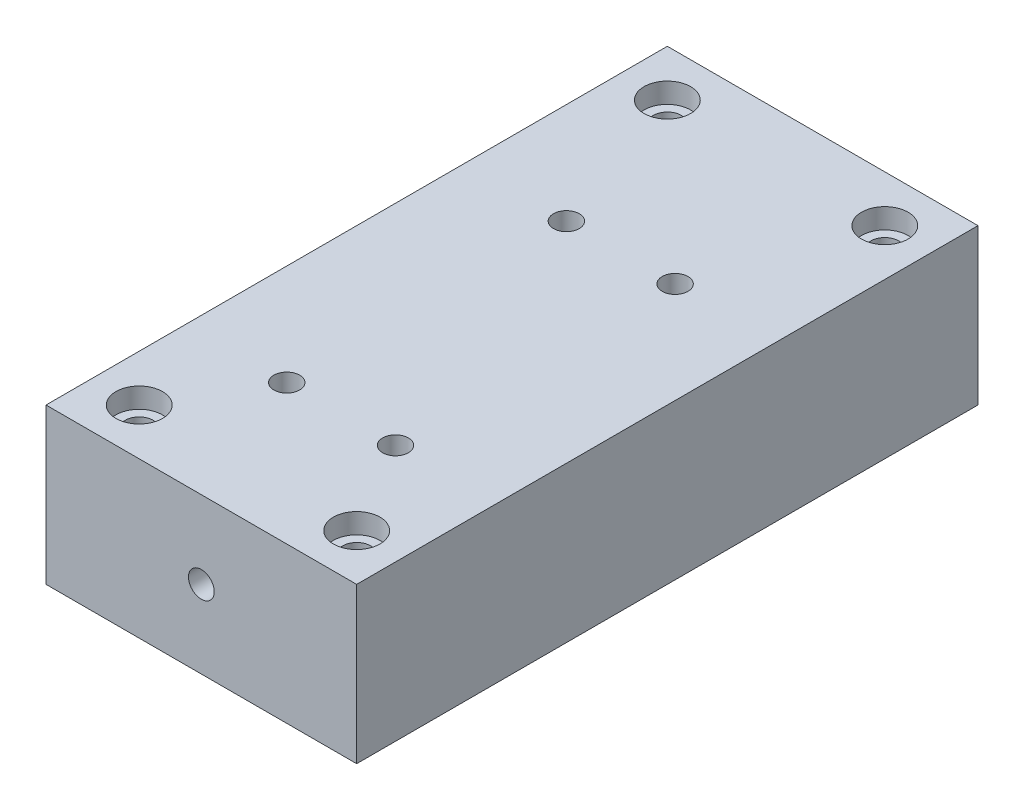
ISO-10303-21;
HEADER;
FILE_DESCRIPTION(('STEP AP214'),'2;1');
FILE_NAME('part.step','',(''),(''),'','','');
FILE_SCHEMA(('AUTOMOTIVE_DESIGN { 1 0 10303 214 1 1 1 1 }'));
ENDSEC;
DATA;
#1=APPLICATION_CONTEXT('core data for automotive mechanical design processes');
#2=APPLICATION_PROTOCOL_DEFINITION('international standard','automotive_design',2000,#1);
#3=PRODUCT_CONTEXT('',#1,'mechanical');
#4=PRODUCT('Part','Part','',(#3));
#5=PRODUCT_RELATED_PRODUCT_CATEGORY('part','',(#4));
#6=PRODUCT_DEFINITION_FORMATION('','',#4);
#7=PRODUCT_DEFINITION_CONTEXT('part definition',#1,'design');
#8=PRODUCT_DEFINITION('design','',#6,#7);
#9=PRODUCT_DEFINITION_SHAPE('','',#8);
#10=(LENGTH_UNIT() NAMED_UNIT(*) SI_UNIT(.MILLI.,.METRE.));
#11=(NAMED_UNIT(*) PLANE_ANGLE_UNIT() SI_UNIT($,.RADIAN.));
#12=(NAMED_UNIT(*) SI_UNIT($,.STERADIAN.) SOLID_ANGLE_UNIT());
#13=UNCERTAINTY_MEASURE_WITH_UNIT(LENGTH_MEASURE(1.E-05),#10,'distance_accuracy_value','');
#14=(GEOMETRIC_REPRESENTATION_CONTEXT(3) GLOBAL_UNCERTAINTY_ASSIGNED_CONTEXT((#13)) GLOBAL_UNIT_ASSIGNED_CONTEXT((#10,
#11,#12)) REPRESENTATION_CONTEXT('',''));
#15=CARTESIAN_POINT('',(0.,0.,0.));
#16=DIRECTION('',(0.,0.,1.));
#17=DIRECTION('',(1.,0.,0.));
#18=AXIS2_PLACEMENT_3D('',#15,#16,#17);
#19=CARTESIAN_POINT('',(50.,-25.,200.));
#20=DIRECTION('',(0.,-1.,0.));
#21=DIRECTION('',(1.,0.,0.));
#22=AXIS2_PLACEMENT_3D('',#19,#20,#21);
#23=PLANE('',#22);
#24=CARTESIAN_POINT('',(-35.,-25.,15.));
#25=DIRECTION('',(0.,1.,0.));
#26=DIRECTION('',(0.,0.,1.));
#27=AXIS2_PLACEMENT_3D('',#24,#25,#26);
#28=CIRCLE('',#27,4.49999999999999);
#29=CARTESIAN_POINT('',(-35.,-25.,19.5));
#30=VERTEX_POINT('',#29);
#31=EDGE_CURVE('E157',#30,#30,#28,.T.);
#32=ORIENTED_EDGE('',*,*,#31,.T.);
#33=EDGE_LOOP('',(#32));
#34=FACE_BOUND('',#33,.T.);
#35=CARTESIAN_POINT('',(35.,-25.,15.));
#36=DIRECTION('',(0.,1.,0.));
#37=DIRECTION('',(0.,0.,1.));
#38=AXIS2_PLACEMENT_3D('',#35,#36,#37);
#39=CIRCLE('',#38,4.49999999999999);
#40=CARTESIAN_POINT('',(35.,-25.,19.5));
#41=VERTEX_POINT('',#40);
#42=EDGE_CURVE('E169',#41,#41,#39,.T.);
#43=ORIENTED_EDGE('',*,*,#42,.T.);
#44=EDGE_LOOP('',(#43));
#45=FACE_BOUND('',#44,.T.);
#46=CARTESIAN_POINT('',(35.,-25.,185.));
#47=DIRECTION('',(0.,1.,0.));
#48=DIRECTION('',(0.,0.,1.));
#49=AXIS2_PLACEMENT_3D('',#46,#47,#48);
#50=CIRCLE('',#49,4.49999999999999);
#51=CARTESIAN_POINT('',(35.,-25.,189.5));
#52=VERTEX_POINT('',#51);
#53=EDGE_CURVE('E181',#52,#52,#50,.T.);
#54=ORIENTED_EDGE('',*,*,#53,.T.);
#55=EDGE_LOOP('',(#54));
#56=FACE_BOUND('',#55,.T.);
#57=CARTESIAN_POINT('',(-35.,-25.,185.));
#58=DIRECTION('',(0.,1.,0.));
#59=DIRECTION('',(0.,0.,1.));
#60=AXIS2_PLACEMENT_3D('',#57,#58,#59);
#61=CIRCLE('',#60,4.49999999999999);
#62=CARTESIAN_POINT('',(-35.,-25.,189.5));
#63=VERTEX_POINT('',#62);
#64=EDGE_CURVE('E193',#63,#63,#61,.T.);
#65=ORIENTED_EDGE('',*,*,#64,.T.);
#66=EDGE_LOOP('',(#65));
#67=FACE_BOUND('',#66,.T.);
#68=DIRECTION('',(-1.,0.,0.));
#69=VECTOR('',#68,1.);
#70=CARTESIAN_POINT('',(50.,-25.,0.));
#71=LINE('',#70,#69);
#72=CARTESIAN_POINT('',(50.,-25.,0.));
#73=VERTEX_POINT('',#72);
#74=CARTESIAN_POINT('',(-50.,-25.,0.));
#75=VERTEX_POINT('',#74);
#76=EDGE_CURVE('E196',#73,#75,#71,.T.);
#77=ORIENTED_EDGE('',*,*,#76,.F.);
#78=DIRECTION('',(0.,0.,-1.));
#79=VECTOR('',#78,1.);
#80=CARTESIAN_POINT('',(50.,-25.,200.));
#81=LINE('',#80,#79);
#82=CARTESIAN_POINT('',(50.,-25.,200.));
#83=VERTEX_POINT('',#82);
#84=EDGE_CURVE('E11',#83,#73,#81,.T.);
#85=ORIENTED_EDGE('',*,*,#84,.F.);
#86=DIRECTION('',(-1.,0.,0.));
#87=VECTOR('',#86,1.);
#88=CARTESIAN_POINT('',(50.,-25.,200.));
#89=LINE('',#88,#87);
#90=CARTESIAN_POINT('',(-50.,-25.,200.));
#91=VERTEX_POINT('',#90);
#92=EDGE_CURVE('E197',#83,#91,#89,.T.);
#93=ORIENTED_EDGE('',*,*,#92,.T.);
#94=DIRECTION('',(0.,0.,-1.));
#95=VECTOR('',#94,1.);
#96=CARTESIAN_POINT('',(-50.,-25.,200.));
#97=LINE('',#96,#95);
#98=EDGE_CURVE('E35',#91,#75,#97,.T.);
#99=ORIENTED_EDGE('',*,*,#98,.T.);
#100=EDGE_LOOP('',(#77,#85,#93,#99));
#101=FACE_BOUND('',#100,.T.);
#102=ADVANCED_FACE('F32',(#34,#45,#56,#67,#101),#23,.T.);
#103=CARTESIAN_POINT('',(50.,-25.,200.));
#104=DIRECTION('',(-1.,0.,0.));
#105=DIRECTION('',(0.,0.,1.));
#106=AXIS2_PLACEMENT_3D('',#103,#104,#105);
#107=PLANE('',#106);
#108=DIRECTION('',(0.,1.,0.));
#109=VECTOR('',#108,1.);
#110=CARTESIAN_POINT('',(50.,-25.,0.));
#111=LINE('',#110,#109);
#112=CARTESIAN_POINT('',(50.,25.,0.));
#113=VERTEX_POINT('',#112);
#114=EDGE_CURVE('E66',#73,#113,#111,.T.);
#115=ORIENTED_EDGE('',*,*,#114,.T.);
#116=DIRECTION('',(0.,0.,-1.));
#117=VECTOR('',#116,1.);
#118=CARTESIAN_POINT('',(50.,25.,200.));
#119=LINE('',#118,#117);
#120=CARTESIAN_POINT('',(50.,25.,200.));
#121=VERTEX_POINT('',#120);
#122=EDGE_CURVE('E41',#121,#113,#119,.T.);
#123=ORIENTED_EDGE('',*,*,#122,.F.);
#124=DIRECTION('',(0.,1.,0.));
#125=VECTOR('',#124,1.);
#126=CARTESIAN_POINT('',(50.,-25.,200.));
#127=LINE('',#126,#125);
#128=EDGE_CURVE('E203',#83,#121,#127,.T.);
#129=ORIENTED_EDGE('',*,*,#128,.F.);
#130=ORIENTED_EDGE('',*,*,#84,.T.);
#131=EDGE_LOOP('',(#115,#123,#129,#130));
#132=FACE_BOUND('',#131,.T.);
#133=ADVANCED_FACE('F224',(#132),#107,.F.);
#134=CARTESIAN_POINT('',(50.,25.,200.));
#135=DIRECTION('',(0.,-1.,0.));
#136=DIRECTION('',(1.,0.,0.));
#137=AXIS2_PLACEMENT_3D('',#134,#135,#136);
#138=PLANE('',#137);
#139=CARTESIAN_POINT('',(-17.5,25.,65.));
#140=DIRECTION('',(0.,1.,0.));
#141=DIRECTION('',(0.,0.,1.));
#142=AXIS2_PLACEMENT_3D('',#139,#140,#141);
#143=CIRCLE('',#142,4.14999999999999);
#144=CARTESIAN_POINT('',(-17.5,25.,69.15));
#145=VERTEX_POINT('',#144);
#146=EDGE_CURVE('E108',#145,#145,#143,.T.);
#147=ORIENTED_EDGE('',*,*,#146,.F.);
#148=EDGE_LOOP('',(#147));
#149=FACE_BOUND('',#148,.T.);
#150=CARTESIAN_POINT('',(17.5,25.,65.));
#151=DIRECTION('',(0.,1.,0.));
#152=DIRECTION('',(0.,0.,1.));
#153=AXIS2_PLACEMENT_3D('',#150,#151,#152);
#154=CIRCLE('',#153,4.14999999999999);
#155=CARTESIAN_POINT('',(17.5,25.,69.15));
#156=VERTEX_POINT('',#155);
#157=EDGE_CURVE('E107',#156,#156,#154,.T.);
#158=ORIENTED_EDGE('',*,*,#157,.F.);
#159=EDGE_LOOP('',(#158));
#160=FACE_BOUND('',#159,.T.);
#161=CARTESIAN_POINT('',(17.5,25.,155.));
#162=DIRECTION('',(0.,1.,0.));
#163=DIRECTION('',(0.,0.,1.));
#164=AXIS2_PLACEMENT_3D('',#161,#162,#163);
#165=CIRCLE('',#164,4.14999999999999);
#166=CARTESIAN_POINT('',(17.5,25.,159.15));
#167=VERTEX_POINT('',#166);
#168=EDGE_CURVE('E118',#167,#167,#165,.T.);
#169=ORIENTED_EDGE('',*,*,#168,.F.);
#170=EDGE_LOOP('',(#169));
#171=FACE_BOUND('',#170,.T.);
#172=CARTESIAN_POINT('',(-17.5,25.,155.));
#173=DIRECTION('',(0.,1.,0.));
#174=DIRECTION('',(0.,0.,1.));
#175=AXIS2_PLACEMENT_3D('',#172,#173,#174);
#176=CIRCLE('',#175,4.14999999999999);
#177=CARTESIAN_POINT('',(-17.5,25.,159.15));
#178=VERTEX_POINT('',#177);
#179=EDGE_CURVE('E124',#178,#178,#176,.T.);
#180=ORIENTED_EDGE('',*,*,#179,.F.);
#181=EDGE_LOOP('',(#180));
#182=FACE_BOUND('',#181,.T.);
#183=CARTESIAN_POINT('',(-35.,25.,15.));
#184=DIRECTION('',(0.,1.,0.));
#185=DIRECTION('',(0.,0.,1.));
#186=AXIS2_PLACEMENT_3D('',#183,#184,#185);
#187=CIRCLE('',#186,7.5);
#188=CARTESIAN_POINT('',(-35.,25.,22.5));
#189=VERTEX_POINT('',#188);
#190=EDGE_CURVE('E148',#189,#189,#187,.T.);
#191=ORIENTED_EDGE('',*,*,#190,.F.);
#192=EDGE_LOOP('',(#191));
#193=FACE_BOUND('',#192,.T.);
#194=CARTESIAN_POINT('',(35.,25.,15.));
#195=DIRECTION('',(0.,1.,0.));
#196=DIRECTION('',(0.,0.,1.));
#197=AXIS2_PLACEMENT_3D('',#194,#195,#196);
#198=CIRCLE('',#197,7.5);
#199=CARTESIAN_POINT('',(35.,25.,22.5));
#200=VERTEX_POINT('',#199);
#201=EDGE_CURVE('E160',#200,#200,#198,.T.);
#202=ORIENTED_EDGE('',*,*,#201,.F.);
#203=EDGE_LOOP('',(#202));
#204=FACE_BOUND('',#203,.T.);
#205=CARTESIAN_POINT('',(35.,25.,185.));
#206=DIRECTION('',(0.,1.,0.));
#207=DIRECTION('',(0.,0.,1.));
#208=AXIS2_PLACEMENT_3D('',#205,#206,#207);
#209=CIRCLE('',#208,7.5);
#210=CARTESIAN_POINT('',(35.,25.,192.5));
#211=VERTEX_POINT('',#210);
#212=EDGE_CURVE('E172',#211,#211,#209,.T.);
#213=ORIENTED_EDGE('',*,*,#212,.F.);
#214=EDGE_LOOP('',(#213));
#215=FACE_BOUND('',#214,.T.);
#216=CARTESIAN_POINT('',(-35.,25.,185.));
#217=DIRECTION('',(0.,1.,0.));
#218=DIRECTION('',(0.,0.,1.));
#219=AXIS2_PLACEMENT_3D('',#216,#217,#218);
#220=CIRCLE('',#219,7.5);
#221=CARTESIAN_POINT('',(-35.,25.,192.5));
#222=VERTEX_POINT('',#221);
#223=EDGE_CURVE('E184',#222,#222,#220,.T.);
#224=ORIENTED_EDGE('',*,*,#223,.F.);
#225=EDGE_LOOP('',(#224));
#226=FACE_BOUND('',#225,.T.);
#227=DIRECTION('',(-1.,0.,0.));
#228=VECTOR('',#227,1.);
#229=CARTESIAN_POINT('',(50.,25.,0.));
#230=LINE('',#229,#228);
#231=CARTESIAN_POINT('',(-50.,25.,0.));
#232=VERTEX_POINT('',#231);
#233=EDGE_CURVE('E210',#113,#232,#230,.T.);
#234=ORIENTED_EDGE('',*,*,#233,.T.);
#235=DIRECTION('',(0.,0.,-1.));
#236=VECTOR('',#235,1.);
#237=CARTESIAN_POINT('',(-50.,25.,200.));
#238=LINE('',#237,#236);
#239=CARTESIAN_POINT('',(-50.,25.,200.));
#240=VERTEX_POINT('',#239);
#241=EDGE_CURVE('E214',#240,#232,#238,.T.);
#242=ORIENTED_EDGE('',*,*,#241,.F.);
#243=DIRECTION('',(-1.,0.,0.));
#244=VECTOR('',#243,1.);
#245=CARTESIAN_POINT('',(50.,25.,200.));
#246=LINE('',#245,#244);
#247=EDGE_CURVE('E201',#121,#240,#246,.T.);
#248=ORIENTED_EDGE('',*,*,#247,.F.);
#249=ORIENTED_EDGE('',*,*,#122,.T.);
#250=EDGE_LOOP('',(#234,#242,#248,#249));
#251=FACE_BOUND('',#250,.T.);
#252=ADVANCED_FACE('F222',(#149,#160,#171,#182,#193,#204,#215,#226,#251),#138,.F.);
#253=CARTESIAN_POINT('',(-50.,-25.,200.));
#254=DIRECTION('',(-1.,0.,0.));
#255=DIRECTION('',(0.,0.,1.));
#256=AXIS2_PLACEMENT_3D('',#253,#254,#255);
#257=PLANE('',#256);
#258=CARTESIAN_POINT('',(-50.,-7.50000000000003,165.));
#259=DIRECTION('',(-1.,0.,0.));
#260=DIRECTION('',(0.,0.,1.));
#261=AXIS2_PLACEMENT_3D('',#258,#259,#260);
#262=CIRCLE('',#261,4.14999999999999);
#263=CARTESIAN_POINT('',(-50.,-7.50000000000003,169.15));
#264=VERTEX_POINT('',#263);
#265=EDGE_CURVE('E136',#264,#264,#262,.T.);
#266=ORIENTED_EDGE('',*,*,#265,.F.);
#267=EDGE_LOOP('',(#266));
#268=FACE_BOUND('',#267,.T.);
#269=CARTESIAN_POINT('',(-50.,-7.50000000000003,35.));
#270=DIRECTION('',(-1.,0.,0.));
#271=DIRECTION('',(0.,0.,1.));
#272=AXIS2_PLACEMENT_3D('',#269,#270,#271);
#273=CIRCLE('',#272,4.14999999999999);
#274=CARTESIAN_POINT('',(-50.,-7.50000000000003,39.1499999999999));
#275=VERTEX_POINT('',#274);
#276=EDGE_CURVE('E142',#275,#275,#273,.T.);
#277=ORIENTED_EDGE('',*,*,#276,.F.);
#278=EDGE_LOOP('',(#277));
#279=FACE_BOUND('',#278,.T.);
#280=DIRECTION('',(0.,1.,0.));
#281=VECTOR('',#280,1.);
#282=CARTESIAN_POINT('',(-50.,-25.,0.));
#283=LINE('',#282,#281);
#284=EDGE_CURVE('E207',#75,#232,#283,.T.);
#285=ORIENTED_EDGE('',*,*,#284,.F.);
#286=ORIENTED_EDGE('',*,*,#98,.F.);
#287=DIRECTION('',(0.,1.,0.));
#288=VECTOR('',#287,1.);
#289=CARTESIAN_POINT('',(-50.,-25.,200.));
#290=LINE('',#289,#288);
#291=EDGE_CURVE('E199',#91,#240,#290,.T.);
#292=ORIENTED_EDGE('',*,*,#291,.T.);
#293=ORIENTED_EDGE('',*,*,#241,.T.);
#294=EDGE_LOOP('',(#285,#286,#292,#293));
#295=FACE_BOUND('',#294,.T.);
#296=ADVANCED_FACE('F217',(#268,#279,#295),#257,.T.);
#297=CARTESIAN_POINT('',(0.,0.,200.));
#298=DIRECTION('',(0.,0.,-1.));
#299=DIRECTION('',(-1.,0.,0.));
#300=AXIS2_PLACEMENT_3D('',#297,#298,#299);
#301=PLANE('',#300);
#302=CARTESIAN_POINT('',(0.,0.,200.));
#303=DIRECTION('',(0.,0.,1.));
#304=DIRECTION('',(1.,0.,0.));
#305=AXIS2_PLACEMENT_3D('',#302,#303,#304);
#306=CIRCLE('',#305,4.14999999999999);
#307=CARTESIAN_POINT('',(4.14999999999999,0.,200.));
#308=VERTEX_POINT('',#307);
#309=EDGE_CURVE('E130',#308,#308,#306,.T.);
#310=ORIENTED_EDGE('',*,*,#309,.F.);
#311=EDGE_LOOP('',(#310));
#312=FACE_BOUND('',#311,.T.);
#313=ORIENTED_EDGE('',*,*,#92,.F.);
#314=ORIENTED_EDGE('',*,*,#128,.T.);
#315=ORIENTED_EDGE('',*,*,#247,.T.);
#316=ORIENTED_EDGE('',*,*,#291,.F.);
#317=EDGE_LOOP('',(#313,#314,#315,#316));
#318=FACE_BOUND('',#317,.T.);
#319=ADVANCED_FACE('F226',(#312,#318),#301,.F.);
#320=CARTESIAN_POINT('',(0.,0.,0.));
#321=DIRECTION('',(0.,0.,-1.));
#322=DIRECTION('',(-1.,0.,0.));
#323=AXIS2_PLACEMENT_3D('',#320,#321,#322);
#324=PLANE('',#323);
#325=ORIENTED_EDGE('',*,*,#76,.T.);
#326=ORIENTED_EDGE('',*,*,#284,.T.);
#327=ORIENTED_EDGE('',*,*,#233,.F.);
#328=ORIENTED_EDGE('',*,*,#114,.F.);
#329=EDGE_LOOP('',(#325,#326,#327,#328));
#330=FACE_BOUND('',#329,.T.);
#331=ADVANCED_FACE('F220',(#330),#324,.T.);
#332=CARTESIAN_POINT('',(-35.,25.,185.));
#333=DIRECTION('',(0.,1.,0.));
#334=DIRECTION('',(0.,0.,1.));
#335=AXIS2_PLACEMENT_3D('',#332,#333,#334);
#336=CYLINDRICAL_SURFACE('',#335,4.5);
#337=ORIENTED_EDGE('',*,*,#64,.F.);
#338=EDGE_LOOP('',(#337));
#339=FACE_BOUND('',#338,.T.);
#340=CARTESIAN_POINT('',(-35.,18.5,185.));
#341=DIRECTION('',(0.,1.,0.));
#342=DIRECTION('',(0.,0.,1.));
#343=AXIS2_PLACEMENT_3D('',#340,#341,#342);
#344=CIRCLE('',#343,4.5);
#345=CARTESIAN_POINT('',(-35.,18.5,189.5));
#346=VERTEX_POINT('',#345);
#347=EDGE_CURVE('E190',#346,#346,#344,.T.);
#348=ORIENTED_EDGE('',*,*,#347,.T.);
#349=EDGE_LOOP('',(#348));
#350=FACE_BOUND('',#349,.T.);
#351=ADVANCED_FACE('F235',(#339,#350),#336,.F.);
#352=CARTESIAN_POINT('',(-30.5,18.5,185.));
#353=DIRECTION('',(0.,-1.,0.));
#354=DIRECTION('',(0.,0.,-1.));
#355=AXIS2_PLACEMENT_3D('',#352,#353,#354);
#356=PLANE('',#355);
#357=ORIENTED_EDGE('',*,*,#347,.F.);
#358=EDGE_LOOP('',(#357));
#359=FACE_BOUND('',#358,.T.);
#360=CARTESIAN_POINT('',(-35.,18.5,185.));
#361=DIRECTION('',(0.,1.,0.));
#362=DIRECTION('',(0.,0.,1.));
#363=AXIS2_PLACEMENT_3D('',#360,#361,#362);
#364=CIRCLE('',#363,7.49999999999999);
#365=CARTESIAN_POINT('',(-35.,18.5,192.5));
#366=VERTEX_POINT('',#365);
#367=EDGE_CURVE('E187',#366,#366,#364,.T.);
#368=ORIENTED_EDGE('',*,*,#367,.T.);
#369=EDGE_LOOP('',(#368));
#370=FACE_BOUND('',#369,.T.);
#371=ADVANCED_FACE('F257',(#359,#370),#356,.F.);
#372=CARTESIAN_POINT('',(-35.,25.,185.));
#373=DIRECTION('',(0.,1.,0.));
#374=DIRECTION('',(0.,0.,1.));
#375=AXIS2_PLACEMENT_3D('',#372,#373,#374);
#376=CYLINDRICAL_SURFACE('',#375,7.49999999999999);
#377=ORIENTED_EDGE('',*,*,#367,.F.);
#378=EDGE_LOOP('',(#377));
#379=FACE_BOUND('',#378,.T.);
#380=ORIENTED_EDGE('',*,*,#223,.T.);
#381=EDGE_LOOP('',(#380));
#382=FACE_BOUND('',#381,.T.);
#383=ADVANCED_FACE('F262',(#379,#382),#376,.F.);
#384=CARTESIAN_POINT('',(35.,25.,185.));
#385=DIRECTION('',(0.,1.,0.));
#386=DIRECTION('',(0.,0.,1.));
#387=AXIS2_PLACEMENT_3D('',#384,#385,#386);
#388=CYLINDRICAL_SURFACE('',#387,4.5);
#389=ORIENTED_EDGE('',*,*,#53,.F.);
#390=EDGE_LOOP('',(#389));
#391=FACE_BOUND('',#390,.T.);
#392=CARTESIAN_POINT('',(35.,18.5,185.));
#393=DIRECTION('',(0.,1.,0.));
#394=DIRECTION('',(0.,0.,1.));
#395=AXIS2_PLACEMENT_3D('',#392,#393,#394);
#396=CIRCLE('',#395,4.5);
#397=CARTESIAN_POINT('',(35.,18.5,189.5));
#398=VERTEX_POINT('',#397);
#399=EDGE_CURVE('E178',#398,#398,#396,.T.);
#400=ORIENTED_EDGE('',*,*,#399,.T.);
#401=EDGE_LOOP('',(#400));
#402=FACE_BOUND('',#401,.T.);
#403=ADVANCED_FACE('F268',(#391,#402),#388,.F.);
#404=CARTESIAN_POINT('',(39.5,18.5,185.));
#405=DIRECTION('',(0.,-1.,0.));
#406=DIRECTION('',(0.,0.,-1.));
#407=AXIS2_PLACEMENT_3D('',#404,#405,#406);
#408=PLANE('',#407);
#409=ORIENTED_EDGE('',*,*,#399,.F.);
#410=EDGE_LOOP('',(#409));
#411=FACE_BOUND('',#410,.T.);
#412=CARTESIAN_POINT('',(35.,18.5,185.));
#413=DIRECTION('',(0.,1.,0.));
#414=DIRECTION('',(0.,0.,1.));
#415=AXIS2_PLACEMENT_3D('',#412,#413,#414);
#416=CIRCLE('',#415,7.49999999999999);
#417=CARTESIAN_POINT('',(35.,18.5,192.5));
#418=VERTEX_POINT('',#417);
#419=EDGE_CURVE('E175',#418,#418,#416,.T.);
#420=ORIENTED_EDGE('',*,*,#419,.T.);
#421=EDGE_LOOP('',(#420));
#422=FACE_BOUND('',#421,.T.);
#423=ADVANCED_FACE('F296',(#411,#422),#408,.F.);
#424=CARTESIAN_POINT('',(35.,25.,185.));
#425=DIRECTION('',(0.,1.,0.));
#426=DIRECTION('',(0.,0.,1.));
#427=AXIS2_PLACEMENT_3D('',#424,#425,#426);
#428=CYLINDRICAL_SURFACE('',#427,7.5);
#429=ORIENTED_EDGE('',*,*,#419,.F.);
#430=EDGE_LOOP('',(#429));
#431=FACE_BOUND('',#430,.T.);
#432=ORIENTED_EDGE('',*,*,#212,.T.);
#433=EDGE_LOOP('',(#432));
#434=FACE_BOUND('',#433,.T.);
#435=ADVANCED_FACE('F293',(#431,#434),#428,.F.);
#436=CARTESIAN_POINT('',(35.,25.,15.));
#437=DIRECTION('',(0.,1.,0.));
#438=DIRECTION('',(0.,0.,1.));
#439=AXIS2_PLACEMENT_3D('',#436,#437,#438);
#440=CYLINDRICAL_SURFACE('',#439,4.5);
#441=ORIENTED_EDGE('',*,*,#42,.F.);
#442=EDGE_LOOP('',(#441));
#443=FACE_BOUND('',#442,.T.);
#444=CARTESIAN_POINT('',(35.,18.5,15.));
#445=DIRECTION('',(0.,1.,0.));
#446=DIRECTION('',(0.,0.,1.));
#447=AXIS2_PLACEMENT_3D('',#444,#445,#446);
#448=CIRCLE('',#447,4.5);
#449=CARTESIAN_POINT('',(35.,18.5,19.5));
#450=VERTEX_POINT('',#449);
#451=EDGE_CURVE('E166',#450,#450,#448,.T.);
#452=ORIENTED_EDGE('',*,*,#451,.T.);
#453=EDGE_LOOP('',(#452));
#454=FACE_BOUND('',#453,.T.);
#455=ADVANCED_FACE('F295',(#443,#454),#440,.F.);
#456=CARTESIAN_POINT('',(39.5,18.5,15.));
#457=DIRECTION('',(0.,-1.,0.));
#458=DIRECTION('',(0.,0.,-1.));
#459=AXIS2_PLACEMENT_3D('',#456,#457,#458);
#460=PLANE('',#459);
#461=ORIENTED_EDGE('',*,*,#451,.F.);
#462=EDGE_LOOP('',(#461));
#463=FACE_BOUND('',#462,.T.);
#464=CARTESIAN_POINT('',(35.,18.5,15.));
#465=DIRECTION('',(0.,1.,0.));
#466=DIRECTION('',(0.,0.,1.));
#467=AXIS2_PLACEMENT_3D('',#464,#465,#466);
#468=CIRCLE('',#467,7.49999999999999);
#469=CARTESIAN_POINT('',(35.,18.5,22.5));
#470=VERTEX_POINT('',#469);
#471=EDGE_CURVE('E163',#470,#470,#468,.T.);
#472=ORIENTED_EDGE('',*,*,#471,.T.);
#473=EDGE_LOOP('',(#472));
#474=FACE_BOUND('',#473,.T.);
#475=ADVANCED_FACE('F303',(#463,#474),#460,.F.);
#476=CARTESIAN_POINT('',(35.,25.,15.));
#477=DIRECTION('',(0.,1.,0.));
#478=DIRECTION('',(0.,0.,1.));
#479=AXIS2_PLACEMENT_3D('',#476,#477,#478);
#480=CYLINDRICAL_SURFACE('',#479,7.5);
#481=ORIENTED_EDGE('',*,*,#471,.F.);
#482=EDGE_LOOP('',(#481));
#483=FACE_BOUND('',#482,.T.);
#484=ORIENTED_EDGE('',*,*,#201,.T.);
#485=EDGE_LOOP('',(#484));
#486=FACE_BOUND('',#485,.T.);
#487=ADVANCED_FACE('F348',(#483,#486),#480,.F.);
#488=CARTESIAN_POINT('',(-35.,25.,15.));
#489=DIRECTION('',(0.,1.,0.));
#490=DIRECTION('',(0.,0.,1.));
#491=AXIS2_PLACEMENT_3D('',#488,#489,#490);
#492=CYLINDRICAL_SURFACE('',#491,4.5);
#493=ORIENTED_EDGE('',*,*,#31,.F.);
#494=EDGE_LOOP('',(#493));
#495=FACE_BOUND('',#494,.T.);
#496=CARTESIAN_POINT('',(-35.,18.5,15.));
#497=DIRECTION('',(0.,1.,0.));
#498=DIRECTION('',(0.,0.,1.));
#499=AXIS2_PLACEMENT_3D('',#496,#497,#498);
#500=CIRCLE('',#499,4.5);
#501=CARTESIAN_POINT('',(-35.,18.5,19.5));
#502=VERTEX_POINT('',#501);
#503=EDGE_CURVE('E154',#502,#502,#500,.T.);
#504=ORIENTED_EDGE('',*,*,#503,.T.);
#505=EDGE_LOOP('',(#504));
#506=FACE_BOUND('',#505,.T.);
#507=ADVANCED_FACE('F357',(#495,#506),#492,.F.);
#508=CARTESIAN_POINT('',(-30.5,18.5,15.));
#509=DIRECTION('',(0.,-1.,0.));
#510=DIRECTION('',(0.,0.,-1.));
#511=AXIS2_PLACEMENT_3D('',#508,#509,#510);
#512=PLANE('',#511);
#513=ORIENTED_EDGE('',*,*,#503,.F.);
#514=EDGE_LOOP('',(#513));
#515=FACE_BOUND('',#514,.T.);
#516=CARTESIAN_POINT('',(-35.,18.5,15.));
#517=DIRECTION('',(0.,1.,0.));
#518=DIRECTION('',(0.,0.,1.));
#519=AXIS2_PLACEMENT_3D('',#516,#517,#518);
#520=CIRCLE('',#519,7.49999999999999);
#521=CARTESIAN_POINT('',(-35.,18.5,22.5));
#522=VERTEX_POINT('',#521);
#523=EDGE_CURVE('E151',#522,#522,#520,.T.);
#524=ORIENTED_EDGE('',*,*,#523,.T.);
#525=EDGE_LOOP('',(#524));
#526=FACE_BOUND('',#525,.T.);
#527=ADVANCED_FACE('F367',(#515,#526),#512,.F.);
#528=CARTESIAN_POINT('',(-35.,25.,15.));
#529=DIRECTION('',(0.,1.,0.));
#530=DIRECTION('',(0.,0.,1.));
#531=AXIS2_PLACEMENT_3D('',#528,#529,#530);
#532=CYLINDRICAL_SURFACE('',#531,7.49999999999999);
#533=ORIENTED_EDGE('',*,*,#523,.F.);
#534=EDGE_LOOP('',(#533));
#535=FACE_BOUND('',#534,.T.);
#536=ORIENTED_EDGE('',*,*,#190,.T.);
#537=EDGE_LOOP('',(#536));
#538=FACE_BOUND('',#537,.T.);
#539=ADVANCED_FACE('F377',(#535,#538),#532,.F.);
#540=CARTESIAN_POINT('',(-30.,-7.50000000000003,35.));
#541=DIRECTION('',(-1.,0.,0.));
#542=DIRECTION('',(0.,0.,1.));
#543=AXIS2_PLACEMENT_3D('',#540,#541,#542);
#544=CONICAL_SURFACE('',#543,4.14999999999999,1.02974425867665);
#545=CARTESIAN_POINT('',(-27.5064284310356,-7.50000000000003,35.));
#546=VERTEX_POINT('',#545);
#547=VERTEX_LOOP('',#546);
#548=FACE_BOUND('',#547,.T.);
#549=CARTESIAN_POINT('',(-30.,-7.50000000000003,35.));
#550=DIRECTION('',(-1.,0.,0.));
#551=DIRECTION('',(0.,0.,1.));
#552=AXIS2_PLACEMENT_3D('',#549,#550,#551);
#553=CIRCLE('',#552,4.14999999999999);
#554=CARTESIAN_POINT('',(-30.,-7.50000000000003,39.1499999999999));
#555=VERTEX_POINT('',#554);
#556=EDGE_CURVE('E145',#555,#555,#553,.T.);
#557=ORIENTED_EDGE('',*,*,#556,.T.);
#558=EDGE_LOOP('',(#557));
#559=FACE_BOUND('',#558,.T.);
#560=ADVANCED_FACE('F387',(#548,#559),#544,.F.);
#561=CARTESIAN_POINT('',(-50.,-7.50000000000003,35.));
#562=DIRECTION('',(-1.,0.,0.));
#563=DIRECTION('',(0.,0.,1.));
#564=AXIS2_PLACEMENT_3D('',#561,#562,#563);
#565=CYLINDRICAL_SURFACE('',#564,4.14999999999999);
#566=ORIENTED_EDGE('',*,*,#556,.F.);
#567=EDGE_LOOP('',(#566));
#568=FACE_BOUND('',#567,.T.);
#569=ORIENTED_EDGE('',*,*,#276,.T.);
#570=EDGE_LOOP('',(#569));
#571=FACE_BOUND('',#570,.T.);
#572=ADVANCED_FACE('F397',(#568,#571),#565,.F.);
#573=CARTESIAN_POINT('',(-30.,-7.50000000000003,165.));
#574=DIRECTION('',(-1.,0.,0.));
#575=DIRECTION('',(0.,0.,1.));
#576=AXIS2_PLACEMENT_3D('',#573,#574,#575);
#577=CONICAL_SURFACE('',#576,4.14999999999999,1.02974425867665);
#578=CARTESIAN_POINT('',(-27.5064284310356,-7.50000000000003,165.));
#579=VERTEX_POINT('',#578);
#580=VERTEX_LOOP('',#579);
#581=FACE_BOUND('',#580,.T.);
#582=CARTESIAN_POINT('',(-30.,-7.50000000000003,165.));
#583=DIRECTION('',(-1.,0.,0.));
#584=DIRECTION('',(0.,0.,1.));
#585=AXIS2_PLACEMENT_3D('',#582,#583,#584);
#586=CIRCLE('',#585,4.14999999999999);
#587=CARTESIAN_POINT('',(-30.,-7.50000000000003,169.15));
#588=VERTEX_POINT('',#587);
#589=EDGE_CURVE('E139',#588,#588,#586,.T.);
#590=ORIENTED_EDGE('',*,*,#589,.T.);
#591=EDGE_LOOP('',(#590));
#592=FACE_BOUND('',#591,.T.);
#593=ADVANCED_FACE('F406',(#581,#592),#577,.F.);
#594=CARTESIAN_POINT('',(-50.,-7.50000000000003,165.));
#595=DIRECTION('',(-1.,0.,0.));
#596=DIRECTION('',(0.,0.,1.));
#597=AXIS2_PLACEMENT_3D('',#594,#595,#596);
#598=CYLINDRICAL_SURFACE('',#597,4.14999999999999);
#599=ORIENTED_EDGE('',*,*,#589,.F.);
#600=EDGE_LOOP('',(#599));
#601=FACE_BOUND('',#600,.T.);
#602=ORIENTED_EDGE('',*,*,#265,.T.);
#603=EDGE_LOOP('',(#602));
#604=FACE_BOUND('',#603,.T.);
#605=ADVANCED_FACE('F420',(#601,#604),#598,.F.);
#606=CARTESIAN_POINT('',(0.,0.,180.));
#607=DIRECTION('',(0.,0.,1.));
#608=DIRECTION('',(1.,0.,0.));
#609=AXIS2_PLACEMENT_3D('',#606,#607,#608);
#610=CONICAL_SURFACE('',#609,4.14999999999999,1.02974425867666);
#611=CARTESIAN_POINT('',(0.,0.,177.506428431036));
#612=VERTEX_POINT('',#611);
#613=VERTEX_LOOP('',#612);
#614=FACE_BOUND('',#613,.T.);
#615=CARTESIAN_POINT('',(0.,0.,180.));
#616=DIRECTION('',(0.,0.,1.));
#617=DIRECTION('',(1.,0.,0.));
#618=AXIS2_PLACEMENT_3D('',#615,#616,#617);
#619=CIRCLE('',#618,4.14999999999999);
#620=CARTESIAN_POINT('',(4.14999999999999,0.,180.));
#621=VERTEX_POINT('',#620);
#622=EDGE_CURVE('E133',#621,#621,#619,.T.);
#623=ORIENTED_EDGE('',*,*,#622,.T.);
#624=EDGE_LOOP('',(#623));
#625=FACE_BOUND('',#624,.T.);
#626=ADVANCED_FACE('F429',(#614,#625),#610,.F.);
#627=CARTESIAN_POINT('',(0.,0.,200.));
#628=DIRECTION('',(0.,0.,1.));
#629=DIRECTION('',(1.,0.,0.));
#630=AXIS2_PLACEMENT_3D('',#627,#628,#629);
#631=CYLINDRICAL_SURFACE('',#630,4.14999999999999);
#632=ORIENTED_EDGE('',*,*,#622,.F.);
#633=EDGE_LOOP('',(#632));
#634=FACE_BOUND('',#633,.T.);
#635=ORIENTED_EDGE('',*,*,#309,.T.);
#636=EDGE_LOOP('',(#635));
#637=FACE_BOUND('',#636,.T.);
#638=ADVANCED_FACE('F439',(#634,#637),#631,.F.);
#639=CARTESIAN_POINT('',(-17.5,5.,155.));
#640=DIRECTION('',(0.,1.,0.));
#641=DIRECTION('',(0.,0.,1.));
#642=AXIS2_PLACEMENT_3D('',#639,#640,#641);
#643=CONICAL_SURFACE('',#642,4.14999999999999,1.02974425867665);
#644=CARTESIAN_POINT('',(-17.5,2.50642843103563,155.));
#645=VERTEX_POINT('',#644);
#646=VERTEX_LOOP('',#645);
#647=FACE_BOUND('',#646,.T.);
#648=CARTESIAN_POINT('',(-17.5,5.,155.));
#649=DIRECTION('',(0.,1.,0.));
#650=DIRECTION('',(0.,0.,1.));
#651=AXIS2_PLACEMENT_3D('',#648,#649,#650);
#652=CIRCLE('',#651,4.14999999999999);
#653=CARTESIAN_POINT('',(-17.5,5.,159.15));
#654=VERTEX_POINT('',#653);
#655=EDGE_CURVE('E127',#654,#654,#652,.T.);
#656=ORIENTED_EDGE('',*,*,#655,.T.);
#657=EDGE_LOOP('',(#656));
#658=FACE_BOUND('',#657,.T.);
#659=ADVANCED_FACE('F445',(#647,#658),#643,.F.);
#660=CARTESIAN_POINT('',(-17.5,25.,155.));
#661=DIRECTION('',(0.,1.,0.));
#662=DIRECTION('',(0.,0.,1.));
#663=AXIS2_PLACEMENT_3D('',#660,#661,#662);
#664=CYLINDRICAL_SURFACE('',#663,4.14999999999999);
#665=ORIENTED_EDGE('',*,*,#655,.F.);
#666=EDGE_LOOP('',(#665));
#667=FACE_BOUND('',#666,.T.);
#668=ORIENTED_EDGE('',*,*,#179,.T.);
#669=EDGE_LOOP('',(#668));
#670=FACE_BOUND('',#669,.T.);
#671=ADVANCED_FACE('F452',(#667,#670),#664,.F.);
#672=CARTESIAN_POINT('',(17.5,5.00000000000001,155.));
#673=DIRECTION('',(0.,1.,0.));
#674=DIRECTION('',(0.,0.,1.));
#675=AXIS2_PLACEMENT_3D('',#672,#673,#674);
#676=CONICAL_SURFACE('',#675,4.14999999999998,1.02974425867665);
#677=CARTESIAN_POINT('',(17.4999999999999,2.50642843103563,155.));
#678=VERTEX_POINT('',#677);
#679=VERTEX_LOOP('',#678);
#680=FACE_BOUND('',#679,.T.);
#681=CARTESIAN_POINT('',(17.5,5.00000000000001,155.));
#682=DIRECTION('',(0.,1.,0.));
#683=DIRECTION('',(0.,0.,1.));
#684=AXIS2_PLACEMENT_3D('',#681,#682,#683);
#685=CIRCLE('',#684,4.14999999999998);
#686=CARTESIAN_POINT('',(17.5,5.00000000000001,159.15));
#687=VERTEX_POINT('',#686);
#688=EDGE_CURVE('E121',#687,#687,#685,.T.);
#689=ORIENTED_EDGE('',*,*,#688,.T.);
#690=EDGE_LOOP('',(#689));
#691=FACE_BOUND('',#690,.T.);
#692=ADVANCED_FACE('F460',(#680,#691),#676,.F.);
#693=CARTESIAN_POINT('',(17.5,25.,155.));
#694=DIRECTION('',(0.,1.,0.));
#695=DIRECTION('',(0.,0.,1.));
#696=AXIS2_PLACEMENT_3D('',#693,#694,#695);
#697=CYLINDRICAL_SURFACE('',#696,4.14999999999999);
#698=ORIENTED_EDGE('',*,*,#688,.F.);
#699=EDGE_LOOP('',(#698));
#700=FACE_BOUND('',#699,.T.);
#701=ORIENTED_EDGE('',*,*,#168,.T.);
#702=EDGE_LOOP('',(#701));
#703=FACE_BOUND('',#702,.T.);
#704=ADVANCED_FACE('F468',(#700,#703),#697,.F.);
#705=CARTESIAN_POINT('',(17.5,5.00000000000001,65.));
#706=DIRECTION('',(0.,1.,0.));
#707=DIRECTION('',(0.,0.,1.));
#708=AXIS2_PLACEMENT_3D('',#705,#706,#707);
#709=CONICAL_SURFACE('',#708,4.14999999999999,1.02974425867665);
#710=CARTESIAN_POINT('',(17.5,2.50642843103563,65.));
#711=VERTEX_POINT('',#710);
#712=VERTEX_LOOP('',#711);
#713=FACE_BOUND('',#712,.T.);
#714=CARTESIAN_POINT('',(17.5,5.00000000000001,65.));
#715=DIRECTION('',(0.,1.,0.));
#716=DIRECTION('',(0.,0.,1.));
#717=AXIS2_PLACEMENT_3D('',#714,#715,#716);
#718=CIRCLE('',#717,4.14999999999999);
#719=CARTESIAN_POINT('',(17.5,5.00000000000001,69.15));
#720=VERTEX_POINT('',#719);
#721=EDGE_CURVE('E111',#720,#720,#718,.T.);
#722=ORIENTED_EDGE('',*,*,#721,.T.);
#723=EDGE_LOOP('',(#722));
#724=FACE_BOUND('',#723,.T.);
#725=ADVANCED_FACE('F476',(#713,#724),#709,.F.);
#726=CARTESIAN_POINT('',(17.5,25.,65.));
#727=DIRECTION('',(0.,1.,0.));
#728=DIRECTION('',(0.,0.,1.));
#729=AXIS2_PLACEMENT_3D('',#726,#727,#728);
#730=CYLINDRICAL_SURFACE('',#729,4.14999999999999);
#731=ORIENTED_EDGE('',*,*,#721,.F.);
#732=EDGE_LOOP('',(#731));
#733=FACE_BOUND('',#732,.T.);
#734=ORIENTED_EDGE('',*,*,#157,.T.);
#735=EDGE_LOOP('',(#734));
#736=FACE_BOUND('',#735,.T.);
#737=ADVANCED_FACE('F101',(#733,#736),#730,.F.);
#738=CARTESIAN_POINT('',(-17.5,5.,65.));
#739=DIRECTION('',(0.,1.,0.));
#740=DIRECTION('',(0.,0.,1.));
#741=AXIS2_PLACEMENT_3D('',#738,#739,#740);
#742=CONICAL_SURFACE('',#741,4.14999999999999,1.02974425867665);
#743=CARTESIAN_POINT('',(-17.5,2.50642843103563,65.));
#744=VERTEX_POINT('',#743);
#745=VERTEX_LOOP('',#744);
#746=FACE_BOUND('',#745,.T.);
#747=CARTESIAN_POINT('',(-17.5,5.,65.));
#748=DIRECTION('',(0.,1.,0.));
#749=DIRECTION('',(0.,0.,1.));
#750=AXIS2_PLACEMENT_3D('',#747,#748,#749);
#751=CIRCLE('',#750,4.14999999999999);
#752=CARTESIAN_POINT('',(-17.5,5.,69.15));
#753=VERTEX_POINT('',#752);
#754=EDGE_CURVE('E105',#753,#753,#751,.T.);
#755=ORIENTED_EDGE('',*,*,#754,.T.);
#756=EDGE_LOOP('',(#755));
#757=FACE_BOUND('',#756,.T.);
#758=ADVANCED_FACE('F97',(#746,#757),#742,.F.);
#759=CARTESIAN_POINT('',(-17.5,25.,65.));
#760=DIRECTION('',(0.,1.,0.));
#761=DIRECTION('',(0.,0.,1.));
#762=AXIS2_PLACEMENT_3D('',#759,#760,#761);
#763=CYLINDRICAL_SURFACE('',#762,4.14999999999999);
#764=ORIENTED_EDGE('',*,*,#754,.F.);
#765=EDGE_LOOP('',(#764));
#766=FACE_BOUND('',#765,.T.);
#767=ORIENTED_EDGE('',*,*,#146,.T.);
#768=EDGE_LOOP('',(#767));
#769=FACE_BOUND('',#768,.T.);
#770=ADVANCED_FACE('F100',(#766,#769),#763,.F.);
#771=CLOSED_SHELL('',(#102,#133,#252,#296,#319,#331,#351,#371,#383,#403,#423,#435,#455,#475,
#487,#507,#527,#539,#560,#572,#593,#605,#626,#638,#659,#671,#692,#704,#725,#737,#758,#770));
#772=MANIFOLD_SOLID_BREP('B2',#771);
#773=ADVANCED_BREP_SHAPE_REPRESENTATION('',(#18,#772),#14);
#774=SHAPE_DEFINITION_REPRESENTATION(#9,#773);
ENDSEC;
END-ISO-10303-21;
